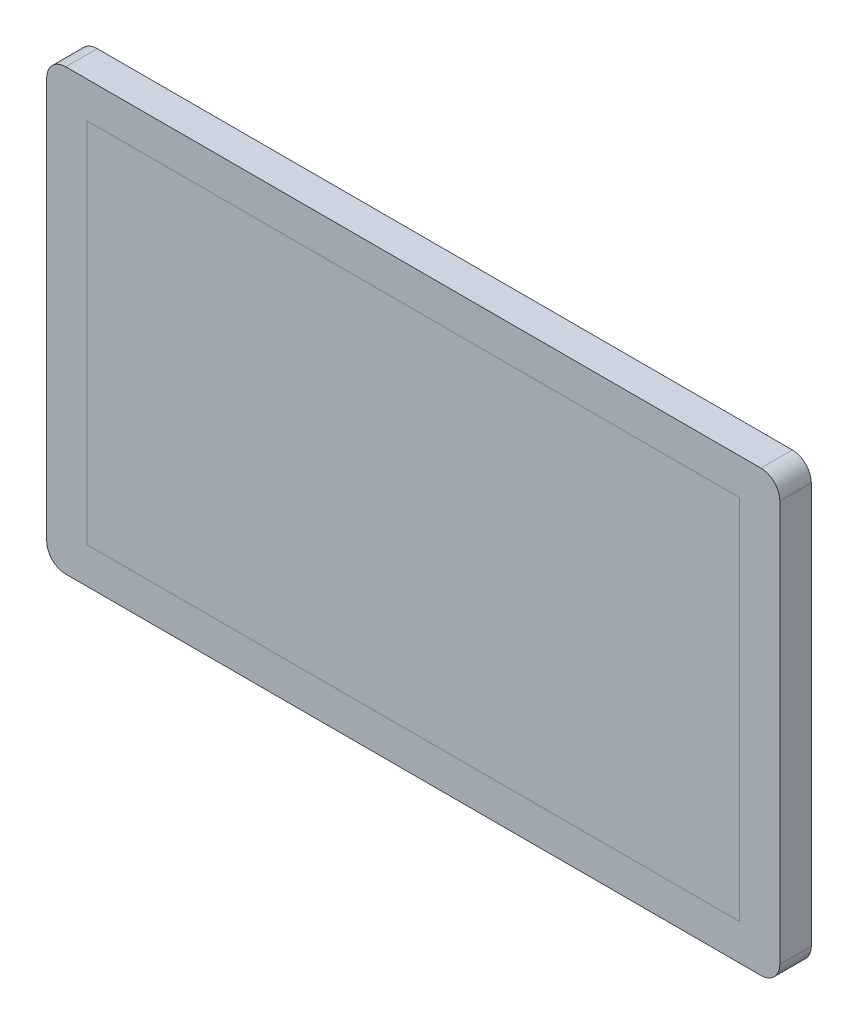
ISO-10303-21;
HEADER;
FILE_DESCRIPTION(('STEP AP214'),'2;1');
FILE_NAME('part.step','',(''),(''),'','','');
FILE_SCHEMA(('AUTOMOTIVE_DESIGN { 1 0 10303 214 1 1 1 1 }'));
ENDSEC;
DATA;
#1=APPLICATION_CONTEXT('core data for automotive mechanical design processes');
#2=APPLICATION_PROTOCOL_DEFINITION('international standard','automotive_design',2000,#1);
#3=PRODUCT_CONTEXT('',#1,'mechanical');
#4=PRODUCT('Part','Part','',(#3));
#5=PRODUCT_RELATED_PRODUCT_CATEGORY('part','',(#4));
#6=PRODUCT_DEFINITION_FORMATION('','',#4);
#7=PRODUCT_DEFINITION_CONTEXT('part definition',#1,'design');
#8=PRODUCT_DEFINITION('design','',#6,#7);
#9=PRODUCT_DEFINITION_SHAPE('','',#8);
#10=(LENGTH_UNIT() NAMED_UNIT(*) SI_UNIT(.MILLI.,.METRE.));
#11=(NAMED_UNIT(*) PLANE_ANGLE_UNIT() SI_UNIT($,.RADIAN.));
#12=(NAMED_UNIT(*) SI_UNIT($,.STERADIAN.) SOLID_ANGLE_UNIT());
#13=UNCERTAINTY_MEASURE_WITH_UNIT(LENGTH_MEASURE(1.E-05),#10,'distance_accuracy_value','');
#14=(GEOMETRIC_REPRESENTATION_CONTEXT(3) GLOBAL_UNCERTAINTY_ASSIGNED_CONTEXT((#13)) GLOBAL_UNIT_ASSIGNED_CONTEXT((#10,
#11,#12)) REPRESENTATION_CONTEXT('',''));
#15=CARTESIAN_POINT('',(0.,0.,0.));
#16=DIRECTION('',(0.,0.,1.));
#17=DIRECTION('',(1.,0.,0.));
#18=AXIS2_PLACEMENT_3D('',#15,#16,#17);
#19=CARTESIAN_POINT('',(183.3,105.85,16.6));
#20=DIRECTION('',(0.,0.,-1.));
#21=DIRECTION('',(-1.,0.,0.));
#22=AXIS2_PLACEMENT_3D('',#19,#20,#21);
#23=PLANE('',#22);
#24=CARTESIAN_POINT('',(183.3,105.85,16.6));
#25=DIRECTION('',(0.,0.,1.));
#26=DIRECTION('',(-1.,0.,0.));
#27=AXIS2_PLACEMENT_3D('',#24,#25,#26);
#28=CIRCLE('',#27,9.99999999999999);
#29=CARTESIAN_POINT('',(193.3,105.85,16.6));
#30=VERTEX_POINT('',#29);
#31=CARTESIAN_POINT('',(183.3,115.85,16.6));
#32=VERTEX_POINT('',#31);
#33=EDGE_CURVE('E121',#30,#32,#28,.T.);
#34=ORIENTED_EDGE('',*,*,#33,.T.);
#35=DIRECTION('',(-1.,0.,0.));
#36=VECTOR('',#35,1.);
#37=CARTESIAN_POINT('',(-183.3,115.85,16.6));
#38=LINE('',#37,#36);
#39=CARTESIAN_POINT('',(-183.3,115.85,16.6));
#40=VERTEX_POINT('',#39);
#41=EDGE_CURVE('E110',#32,#40,#38,.T.);
#42=ORIENTED_EDGE('',*,*,#41,.T.);
#43=CARTESIAN_POINT('',(-183.3,105.85,16.6));
#44=DIRECTION('',(0.,0.,1.));
#45=DIRECTION('',(-1.,0.,0.));
#46=AXIS2_PLACEMENT_3D('',#43,#44,#45);
#47=CIRCLE('',#46,10.);
#48=CARTESIAN_POINT('',(-193.3,105.85,16.6));
#49=VERTEX_POINT('',#48);
#50=EDGE_CURVE('E120',#40,#49,#47,.T.);
#51=ORIENTED_EDGE('',*,*,#50,.T.);
#52=DIRECTION('',(0.,-1.,0.));
#53=VECTOR('',#52,1.);
#54=CARTESIAN_POINT('',(-193.3,105.85,16.6));
#55=LINE('',#54,#53);
#56=CARTESIAN_POINT('',(-193.3,-105.85,16.6));
#57=VERTEX_POINT('',#56);
#58=EDGE_CURVE('E270',#49,#57,#55,.T.);
#59=ORIENTED_EDGE('',*,*,#58,.T.);
#60=CARTESIAN_POINT('',(-183.3,-105.85,16.6));
#61=DIRECTION('',(0.,0.,1.));
#62=DIRECTION('',(-1.,0.,0.));
#63=AXIS2_PLACEMENT_3D('',#60,#61,#62);
#64=CIRCLE('',#63,9.99999999999999);
#65=CARTESIAN_POINT('',(-183.3,-115.85,16.6));
#66=VERTEX_POINT('',#65);
#67=EDGE_CURVE('E297',#57,#66,#64,.T.);
#68=ORIENTED_EDGE('',*,*,#67,.T.);
#69=DIRECTION('',(1.,0.,0.));
#70=VECTOR('',#69,1.);
#71=CARTESIAN_POINT('',(-183.3,-115.85,16.6));
#72=LINE('',#71,#70);
#73=CARTESIAN_POINT('',(183.3,-115.85,16.6));
#74=VERTEX_POINT('',#73);
#75=EDGE_CURVE('E299',#66,#74,#72,.T.);
#76=ORIENTED_EDGE('',*,*,#75,.T.);
#77=CARTESIAN_POINT('',(183.3,-105.85,16.6));
#78=DIRECTION('',(0.,0.,1.));
#79=DIRECTION('',(-1.,0.,0.));
#80=AXIS2_PLACEMENT_3D('',#77,#78,#79);
#81=CIRCLE('',#80,10.);
#82=CARTESIAN_POINT('',(193.3,-105.85,16.6));
#83=VERTEX_POINT('',#82);
#84=EDGE_CURVE('E301',#74,#83,#81,.T.);
#85=ORIENTED_EDGE('',*,*,#84,.T.);
#86=DIRECTION('',(0.,1.,0.));
#87=VECTOR('',#86,1.);
#88=CARTESIAN_POINT('',(193.3,105.85,16.6));
#89=LINE('',#88,#87);
#90=EDGE_CURVE('E126',#83,#30,#89,.T.);
#91=ORIENTED_EDGE('',*,*,#90,.T.);
#92=EDGE_LOOP('',(#34,#42,#51,#59,#68,#76,#85,#91));
#93=FACE_BOUND('',#92,.T.);
#94=DIRECTION('',(0.,1.,0.));
#95=VECTOR('',#94,1.);
#96=CARTESIAN_POINT('',(172.1,105.85,16.6));
#97=LINE('',#96,#95);
#98=CARTESIAN_POINT('',(172.1,-96.8,16.6));
#99=VERTEX_POINT('',#98);
#100=CARTESIAN_POINT('',(172.1,96.8,16.6));
#101=VERTEX_POINT('',#100);
#102=EDGE_CURVE('E11',#99,#101,#97,.T.);
#103=ORIENTED_EDGE('',*,*,#102,.F.);
#104=DIRECTION('',(1.,0.,0.));
#105=VECTOR('',#104,1.);
#106=CARTESIAN_POINT('',(183.3,-96.8,16.6));
#107=LINE('',#106,#105);
#108=CARTESIAN_POINT('',(-172.1,-96.8,16.6));
#109=VERTEX_POINT('',#108);
#110=EDGE_CURVE('E134',#109,#99,#107,.T.);
#111=ORIENTED_EDGE('',*,*,#110,.F.);
#112=DIRECTION('',(0.,-1.,0.));
#113=VECTOR('',#112,1.);
#114=CARTESIAN_POINT('',(-172.1,105.85,16.6));
#115=LINE('',#114,#113);
#116=CARTESIAN_POINT('',(-172.1,96.8,16.6));
#117=VERTEX_POINT('',#116);
#118=EDGE_CURVE('E137',#117,#109,#115,.T.);
#119=ORIENTED_EDGE('',*,*,#118,.F.);
#120=DIRECTION('',(-1.,0.,0.));
#121=VECTOR('',#120,1.);
#122=CARTESIAN_POINT('',(183.3,96.8,16.6));
#123=LINE('',#122,#121);
#124=EDGE_CURVE('E46',#101,#117,#123,.T.);
#125=ORIENTED_EDGE('',*,*,#124,.F.);
#126=EDGE_LOOP('',(#103,#111,#119,#125));
#127=FACE_BOUND('',#126,.T.);
#128=ADVANCED_FACE('F37',(#93,#127),#23,.F.);
#129=CARTESIAN_POINT('',(183.3,105.85,16.6));
#130=DIRECTION('',(0.,0.,-1.));
#131=DIRECTION('',(-1.,0.,0.));
#132=AXIS2_PLACEMENT_3D('',#129,#130,#131);
#133=CYLINDRICAL_SURFACE('',#132,9.99999999999999);
#134=CARTESIAN_POINT('',(183.3,105.85,0.));
#135=DIRECTION('',(0.,0.,1.));
#136=DIRECTION('',(-1.,0.,0.));
#137=AXIS2_PLACEMENT_3D('',#134,#135,#136);
#138=CIRCLE('',#137,9.99999999999999);
#139=CARTESIAN_POINT('',(193.3,105.85,0.));
#140=VERTEX_POINT('',#139);
#141=CARTESIAN_POINT('',(183.3,115.85,0.));
#142=VERTEX_POINT('',#141);
#143=EDGE_CURVE('E133',#140,#142,#138,.T.);
#144=ORIENTED_EDGE('',*,*,#143,.T.);
#145=DIRECTION('',(0.,0.,-1.));
#146=VECTOR('',#145,1.);
#147=CARTESIAN_POINT('',(183.3,115.85,16.6));
#148=LINE('',#147,#146);
#149=EDGE_CURVE('E114',#32,#142,#148,.T.);
#150=ORIENTED_EDGE('',*,*,#149,.F.);
#151=ORIENTED_EDGE('',*,*,#33,.F.);
#152=DIRECTION('',(0.,0.,-1.));
#153=VECTOR('',#152,1.);
#154=CARTESIAN_POINT('',(193.3,105.85,16.6));
#155=LINE('',#154,#153);
#156=EDGE_CURVE('E284',#30,#140,#155,.T.);
#157=ORIENTED_EDGE('',*,*,#156,.T.);
#158=EDGE_LOOP('',(#144,#150,#151,#157));
#159=FACE_BOUND('',#158,.T.);
#160=ADVANCED_FACE('F39',(#159),#133,.T.);
#161=CARTESIAN_POINT('',(-183.3,115.85,16.6));
#162=DIRECTION('',(0.,-1.,0.));
#163=DIRECTION('',(0.,0.,-1.));
#164=AXIS2_PLACEMENT_3D('',#161,#162,#163);
#165=PLANE('',#164);
#166=DIRECTION('',(-1.,0.,0.));
#167=VECTOR('',#166,1.);
#168=CARTESIAN_POINT('',(-183.3,115.85,0.));
#169=LINE('',#168,#167);
#170=CARTESIAN_POINT('',(-183.3,115.85,0.));
#171=VERTEX_POINT('',#170);
#172=EDGE_CURVE('E266',#142,#171,#169,.T.);
#173=ORIENTED_EDGE('',*,*,#172,.T.);
#174=DIRECTION('',(0.,0.,-1.));
#175=VECTOR('',#174,1.);
#176=CARTESIAN_POINT('',(-183.3,115.85,16.6));
#177=LINE('',#176,#175);
#178=EDGE_CURVE('E117',#40,#171,#177,.T.);
#179=ORIENTED_EDGE('',*,*,#178,.F.);
#180=ORIENTED_EDGE('',*,*,#41,.F.);
#181=ORIENTED_EDGE('',*,*,#149,.T.);
#182=EDGE_LOOP('',(#173,#179,#180,#181));
#183=FACE_BOUND('',#182,.T.);
#184=ADVANCED_FACE('F112',(#183),#165,.F.);
#185=CARTESIAN_POINT('',(-183.3,105.85,16.6));
#186=DIRECTION('',(0.,0.,-1.));
#187=DIRECTION('',(-1.,0.,0.));
#188=AXIS2_PLACEMENT_3D('',#185,#186,#187);
#189=CYLINDRICAL_SURFACE('',#188,10.);
#190=CARTESIAN_POINT('',(-183.3,105.85,0.));
#191=DIRECTION('',(0.,0.,1.));
#192=DIRECTION('',(-1.,0.,0.));
#193=AXIS2_PLACEMENT_3D('',#190,#191,#192);
#194=CIRCLE('',#193,10.);
#195=CARTESIAN_POINT('',(-193.3,105.85,0.));
#196=VERTEX_POINT('',#195);
#197=EDGE_CURVE('E261',#171,#196,#194,.T.);
#198=ORIENTED_EDGE('',*,*,#197,.T.);
#199=DIRECTION('',(0.,0.,-1.));
#200=VECTOR('',#199,1.);
#201=CARTESIAN_POINT('',(-193.3,105.85,16.6));
#202=LINE('',#201,#200);
#203=EDGE_CURVE('E139',#49,#196,#202,.T.);
#204=ORIENTED_EDGE('',*,*,#203,.F.);
#205=ORIENTED_EDGE('',*,*,#50,.F.);
#206=ORIENTED_EDGE('',*,*,#178,.T.);
#207=EDGE_LOOP('',(#198,#204,#205,#206));
#208=FACE_BOUND('',#207,.T.);
#209=ADVANCED_FACE('F189',(#208),#189,.T.);
#210=CARTESIAN_POINT('',(-193.3,105.85,16.6));
#211=DIRECTION('',(1.,0.,0.));
#212=DIRECTION('',(0.,1.,0.));
#213=AXIS2_PLACEMENT_3D('',#210,#211,#212);
#214=PLANE('',#213);
#215=DIRECTION('',(0.,-1.,0.));
#216=VECTOR('',#215,1.);
#217=CARTESIAN_POINT('',(-193.3,105.85,0.));
#218=LINE('',#217,#216);
#219=CARTESIAN_POINT('',(-193.3,-105.85,0.));
#220=VERTEX_POINT('',#219);
#221=EDGE_CURVE('E265',#196,#220,#218,.T.);
#222=ORIENTED_EDGE('',*,*,#221,.T.);
#223=DIRECTION('',(0.,0.,-1.));
#224=VECTOR('',#223,1.);
#225=CARTESIAN_POINT('',(-193.3,-105.85,16.6));
#226=LINE('',#225,#224);
#227=EDGE_CURVE('E271',#57,#220,#226,.T.);
#228=ORIENTED_EDGE('',*,*,#227,.F.);
#229=ORIENTED_EDGE('',*,*,#58,.F.);
#230=ORIENTED_EDGE('',*,*,#203,.T.);
#231=EDGE_LOOP('',(#222,#228,#229,#230));
#232=FACE_BOUND('',#231,.T.);
#233=ADVANCED_FACE('F185',(#232),#214,.F.);
#234=CARTESIAN_POINT('',(-183.3,-105.85,16.6));
#235=DIRECTION('',(0.,0.,-1.));
#236=DIRECTION('',(-1.,0.,0.));
#237=AXIS2_PLACEMENT_3D('',#234,#235,#236);
#238=CYLINDRICAL_SURFACE('',#237,9.99999999999999);
#239=CARTESIAN_POINT('',(-183.3,-105.85,0.));
#240=DIRECTION('',(0.,0.,1.));
#241=DIRECTION('',(-1.,0.,0.));
#242=AXIS2_PLACEMENT_3D('',#239,#240,#241);
#243=CIRCLE('',#242,9.99999999999999);
#244=CARTESIAN_POINT('',(-183.3,-115.85,0.));
#245=VERTEX_POINT('',#244);
#246=EDGE_CURVE('E274',#220,#245,#243,.T.);
#247=ORIENTED_EDGE('',*,*,#246,.T.);
#248=DIRECTION('',(0.,0.,-1.));
#249=VECTOR('',#248,1.);
#250=CARTESIAN_POINT('',(-183.3,-115.85,16.6));
#251=LINE('',#250,#249);
#252=EDGE_CURVE('E292',#66,#245,#251,.T.);
#253=ORIENTED_EDGE('',*,*,#252,.F.);
#254=ORIENTED_EDGE('',*,*,#67,.F.);
#255=ORIENTED_EDGE('',*,*,#227,.T.);
#256=EDGE_LOOP('',(#247,#253,#254,#255));
#257=FACE_BOUND('',#256,.T.);
#258=ADVANCED_FACE('F181',(#257),#238,.T.);
#259=CARTESIAN_POINT('',(-183.3,-115.85,16.6));
#260=DIRECTION('',(0.,1.,0.));
#261=DIRECTION('',(0.,0.,1.));
#262=AXIS2_PLACEMENT_3D('',#259,#260,#261);
#263=PLANE('',#262);
#264=DIRECTION('',(1.,0.,0.));
#265=VECTOR('',#264,1.);
#266=CARTESIAN_POINT('',(-183.3,-115.85,0.));
#267=LINE('',#266,#265);
#268=CARTESIAN_POINT('',(183.3,-115.85,0.));
#269=VERTEX_POINT('',#268);
#270=EDGE_CURVE('E276',#245,#269,#267,.T.);
#271=ORIENTED_EDGE('',*,*,#270,.T.);
#272=DIRECTION('',(0.,0.,-1.));
#273=VECTOR('',#272,1.);
#274=CARTESIAN_POINT('',(183.3,-115.85,16.6));
#275=LINE('',#274,#273);
#276=EDGE_CURVE('E289',#74,#269,#275,.T.);
#277=ORIENTED_EDGE('',*,*,#276,.F.);
#278=ORIENTED_EDGE('',*,*,#75,.F.);
#279=ORIENTED_EDGE('',*,*,#252,.T.);
#280=EDGE_LOOP('',(#271,#277,#278,#279));
#281=FACE_BOUND('',#280,.T.);
#282=ADVANCED_FACE('F175',(#281),#263,.F.);
#283=CARTESIAN_POINT('',(183.3,-105.85,16.6));
#284=DIRECTION('',(0.,0.,-1.));
#285=DIRECTION('',(-1.,0.,0.));
#286=AXIS2_PLACEMENT_3D('',#283,#284,#285);
#287=CYLINDRICAL_SURFACE('',#286,10.);
#288=CARTESIAN_POINT('',(183.3,-105.85,0.));
#289=DIRECTION('',(0.,0.,1.));
#290=DIRECTION('',(-1.,0.,0.));
#291=AXIS2_PLACEMENT_3D('',#288,#289,#290);
#292=CIRCLE('',#291,10.);
#293=CARTESIAN_POINT('',(193.3,-105.85,0.));
#294=VERTEX_POINT('',#293);
#295=EDGE_CURVE('E281',#269,#294,#292,.T.);
#296=ORIENTED_EDGE('',*,*,#295,.T.);
#297=DIRECTION('',(0.,0.,-1.));
#298=VECTOR('',#297,1.);
#299=CARTESIAN_POINT('',(193.3,-105.85,16.6));
#300=LINE('',#299,#298);
#301=EDGE_CURVE('E286',#83,#294,#300,.T.);
#302=ORIENTED_EDGE('',*,*,#301,.F.);
#303=ORIENTED_EDGE('',*,*,#84,.F.);
#304=ORIENTED_EDGE('',*,*,#276,.T.);
#305=EDGE_LOOP('',(#296,#302,#303,#304));
#306=FACE_BOUND('',#305,.T.);
#307=ADVANCED_FACE('F169',(#306),#287,.T.);
#308=CARTESIAN_POINT('',(193.3,105.85,16.6));
#309=DIRECTION('',(-1.,0.,0.));
#310=DIRECTION('',(0.,-1.,0.));
#311=AXIS2_PLACEMENT_3D('',#308,#309,#310);
#312=PLANE('',#311);
#313=DIRECTION('',(0.,1.,0.));
#314=VECTOR('',#313,1.);
#315=CARTESIAN_POINT('',(193.3,105.85,0.));
#316=LINE('',#315,#314);
#317=EDGE_CURVE('E130',#294,#140,#316,.T.);
#318=ORIENTED_EDGE('',*,*,#317,.T.);
#319=ORIENTED_EDGE('',*,*,#156,.F.);
#320=ORIENTED_EDGE('',*,*,#90,.F.);
#321=ORIENTED_EDGE('',*,*,#301,.T.);
#322=EDGE_LOOP('',(#318,#319,#320,#321));
#323=FACE_BOUND('',#322,.T.);
#324=ADVANCED_FACE('F163',(#323),#312,.F.);
#325=ORIENTED_EDGE('',*,*,#110,.T.);
#326=ORIENTED_EDGE('',*,*,#102,.T.);
#327=ORIENTED_EDGE('',*,*,#124,.T.);
#328=ORIENTED_EDGE('',*,*,#118,.T.);
#329=EDGE_LOOP('',(#325,#326,#327,#328));
#330=FACE_BOUND('',#329,.T.);
#331=ADVANCED_FACE('F154',(#330),#23,.F.);
#332=CARTESIAN_POINT('',(183.3,105.85,0.));
#333=DIRECTION('',(0.,0.,-1.));
#334=DIRECTION('',(-1.,0.,0.));
#335=AXIS2_PLACEMENT_3D('',#332,#333,#334);
#336=PLANE('',#335);
#337=ORIENTED_EDGE('',*,*,#143,.F.);
#338=ORIENTED_EDGE('',*,*,#317,.F.);
#339=ORIENTED_EDGE('',*,*,#295,.F.);
#340=ORIENTED_EDGE('',*,*,#270,.F.);
#341=ORIENTED_EDGE('',*,*,#246,.F.);
#342=ORIENTED_EDGE('',*,*,#221,.F.);
#343=ORIENTED_EDGE('',*,*,#197,.F.);
#344=ORIENTED_EDGE('',*,*,#172,.F.);
#345=EDGE_LOOP('',(#337,#338,#339,#340,#341,#342,#343,#344));
#346=FACE_BOUND('',#345,.T.);
#347=ADVANCED_FACE('F162',(#346),#336,.T.);
#348=CLOSED_SHELL('',(#128,#160,#184,#209,#233,#258,#282,#307,#324,#331,#347));
#349=MANIFOLD_SOLID_BREP('B2',#348);
#350=ADVANCED_BREP_SHAPE_REPRESENTATION('',(#18,#349),#14);
#351=SHAPE_DEFINITION_REPRESENTATION(#9,#350);
ENDSEC;
END-ISO-10303-21;
